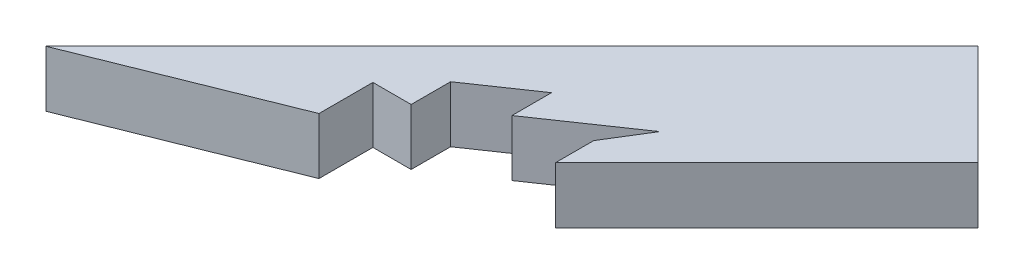
ISO-10303-21;
HEADER;
FILE_DESCRIPTION(('STEP AP214'),'2;1');
FILE_NAME('part.step','',(''),(''),'','','');
FILE_SCHEMA(('AUTOMOTIVE_DESIGN { 1 0 10303 214 1 1 1 1 }'));
ENDSEC;
DATA;
#1=APPLICATION_CONTEXT('core data for automotive mechanical design processes');
#2=APPLICATION_PROTOCOL_DEFINITION('international standard','automotive_design',2000,#1);
#3=PRODUCT_CONTEXT('',#1,'mechanical');
#4=PRODUCT('Part','Part','',(#3));
#5=PRODUCT_RELATED_PRODUCT_CATEGORY('part','',(#4));
#6=PRODUCT_DEFINITION_FORMATION('','',#4);
#7=PRODUCT_DEFINITION_CONTEXT('part definition',#1,'design');
#8=PRODUCT_DEFINITION('design','',#6,#7);
#9=PRODUCT_DEFINITION_SHAPE('','',#8);
#10=(LENGTH_UNIT() NAMED_UNIT(*) SI_UNIT(.MILLI.,.METRE.));
#11=(NAMED_UNIT(*) PLANE_ANGLE_UNIT() SI_UNIT($,.RADIAN.));
#12=(NAMED_UNIT(*) SI_UNIT($,.STERADIAN.) SOLID_ANGLE_UNIT());
#13=UNCERTAINTY_MEASURE_WITH_UNIT(LENGTH_MEASURE(1.E-05),#10,'distance_accuracy_value','');
#14=(GEOMETRIC_REPRESENTATION_CONTEXT(3) GLOBAL_UNCERTAINTY_ASSIGNED_CONTEXT((#13)) GLOBAL_UNIT_ASSIGNED_CONTEXT((#10,
#11,#12)) REPRESENTATION_CONTEXT('',''));
#15=CARTESIAN_POINT('',(0.,0.,0.));
#16=DIRECTION('',(0.,0.,1.));
#17=DIRECTION('',(1.,0.,0.));
#18=AXIS2_PLACEMENT_3D('',#15,#16,#17);
#19=CARTESIAN_POINT('',(-68.6002195806966,12.7,25.6760821859179));
#20=DIRECTION('',(-0.372818660827134,0.,-0.927904222503089));
#21=DIRECTION('',(-0.927904222503089,0.,0.372818660827134));
#22=AXIS2_PLACEMENT_3D('',#19,#20,#21);
#23=PLANE('',#22);
#24=DIRECTION('',(0.927904222503089,0.,-0.372818660827134));
#25=VECTOR('',#24,1.);
#26=CARTESIAN_POINT('',(-68.6002195806966,0.,25.6760821859179));
#27=LINE('',#26,#25);
#28=CARTESIAN_POINT('',(-112.504360112342,0.,43.3161386495255));
#29=VERTEX_POINT('',#28);
#30=CARTESIAN_POINT('',(-68.6002195806966,0.,25.6760821859179));
#31=VERTEX_POINT('',#30);
#32=EDGE_CURVE('E153',#29,#31,#27,.T.);
#33=ORIENTED_EDGE('',*,*,#32,.T.);
#34=DIRECTION('',(0.,-1.,0.));
#35=VECTOR('',#34,1.);
#36=CARTESIAN_POINT('',(-68.6002195806966,12.7,25.6760821859179));
#37=LINE('',#36,#35);
#38=CARTESIAN_POINT('',(-68.6002195806966,12.7,25.6760821859179));
#39=VERTEX_POINT('',#38);
#40=EDGE_CURVE('E11',#39,#31,#37,.T.);
#41=ORIENTED_EDGE('',*,*,#40,.F.);
#42=DIRECTION('',(0.927904222503089,0.,-0.372818660827134));
#43=VECTOR('',#42,1.);
#44=CARTESIAN_POINT('',(-68.6002195806966,12.7,25.6760821859179));
#45=LINE('',#44,#43);
#46=CARTESIAN_POINT('',(-112.504360112342,12.7,43.3161386495255));
#47=VERTEX_POINT('',#46);
#48=EDGE_CURVE('E175',#47,#39,#45,.T.);
#49=ORIENTED_EDGE('',*,*,#48,.F.);
#50=DIRECTION('',(0.,-1.,0.));
#51=VECTOR('',#50,1.);
#52=CARTESIAN_POINT('',(-112.504360112342,12.7,43.3161386495255));
#53=LINE('',#52,#51);
#54=EDGE_CURVE('E149',#47,#29,#53,.T.);
#55=ORIENTED_EDGE('',*,*,#54,.T.);
#56=EDGE_LOOP('',(#33,#41,#49,#55));
#57=FACE_BOUND('',#56,.T.);
#58=ADVANCED_FACE('F33',(#57),#23,.F.);
#59=CARTESIAN_POINT('',(-68.6002195806966,12.7,13.524043288766));
#60=DIRECTION('',(-1.,0.,0.));
#61=DIRECTION('',(0.,0.,1.));
#62=AXIS2_PLACEMENT_3D('',#59,#60,#61);
#63=PLANE('',#62);
#64=DIRECTION('',(0.,0.,-1.));
#65=VECTOR('',#64,1.);
#66=CARTESIAN_POINT('',(-68.6002195806966,0.,13.524043288766));
#67=LINE('',#66,#65);
#68=CARTESIAN_POINT('',(-68.6002195806966,0.,13.524043288766));
#69=VERTEX_POINT('',#68);
#70=EDGE_CURVE('E156',#31,#69,#67,.T.);
#71=ORIENTED_EDGE('',*,*,#70,.T.);
#72=DIRECTION('',(0.,-1.,0.));
#73=VECTOR('',#72,1.);
#74=CARTESIAN_POINT('',(-68.6002195806966,12.7,13.524043288766));
#75=LINE('',#74,#73);
#76=CARTESIAN_POINT('',(-68.6002195806966,12.7,13.524043288766));
#77=VERTEX_POINT('',#76);
#78=EDGE_CURVE('E41',#77,#69,#75,.T.);
#79=ORIENTED_EDGE('',*,*,#78,.F.);
#80=DIRECTION('',(0.,0.,-1.));
#81=VECTOR('',#80,1.);
#82=CARTESIAN_POINT('',(-68.6002195806966,12.7,13.524043288766));
#83=LINE('',#82,#81);
#84=EDGE_CURVE('E104',#39,#77,#83,.T.);
#85=ORIENTED_EDGE('',*,*,#84,.F.);
#86=ORIENTED_EDGE('',*,*,#40,.T.);
#87=EDGE_LOOP('',(#71,#79,#85,#86));
#88=FACE_BOUND('',#87,.T.);
#89=ADVANCED_FACE('F253',(#88),#63,.F.);
#90=CARTESIAN_POINT('',(-59.9761919762662,12.7,13.524043288766));
#91=DIRECTION('',(0.,0.,-1.));
#92=DIRECTION('',(-1.,0.,0.));
#93=AXIS2_PLACEMENT_3D('',#90,#91,#92);
#94=PLANE('',#93);
#95=DIRECTION('',(1.,0.,0.));
#96=VECTOR('',#95,1.);
#97=CARTESIAN_POINT('',(-59.9761919762662,0.,13.524043288766));
#98=LINE('',#97,#96);
#99=CARTESIAN_POINT('',(-59.9761919762662,0.,13.524043288766));
#100=VERTEX_POINT('',#99);
#101=EDGE_CURVE('E158',#69,#100,#98,.T.);
#102=ORIENTED_EDGE('',*,*,#101,.T.);
#103=DIRECTION('',(0.,-1.,0.));
#104=VECTOR('',#103,1.);
#105=CARTESIAN_POINT('',(-59.9761919762662,12.7,13.524043288766));
#106=LINE('',#105,#104);
#107=CARTESIAN_POINT('',(-59.9761919762662,12.7,13.524043288766));
#108=VERTEX_POINT('',#107);
#109=EDGE_CURVE('E194',#108,#100,#106,.T.);
#110=ORIENTED_EDGE('',*,*,#109,.F.);
#111=DIRECTION('',(1.,0.,0.));
#112=VECTOR('',#111,1.);
#113=CARTESIAN_POINT('',(-59.9761919762662,12.7,13.524043288766));
#114=LINE('',#113,#112);
#115=EDGE_CURVE('E202',#77,#108,#114,.T.);
#116=ORIENTED_EDGE('',*,*,#115,.F.);
#117=ORIENTED_EDGE('',*,*,#78,.T.);
#118=EDGE_LOOP('',(#102,#110,#116,#117));
#119=FACE_BOUND('',#118,.T.);
#120=ADVANCED_FACE('F200',(#119),#94,.F.);
#121=CARTESIAN_POINT('',(-59.9761919762662,12.7,4.63318314706994));
#122=DIRECTION('',(-1.,0.,0.));
#123=DIRECTION('',(0.,0.,1.));
#124=AXIS2_PLACEMENT_3D('',#121,#122,#123);
#125=PLANE('',#124);
#126=DIRECTION('',(0.,0.,-1.));
#127=VECTOR('',#126,1.);
#128=CARTESIAN_POINT('',(-59.9761919762662,0.,4.63318314706994));
#129=LINE('',#128,#127);
#130=CARTESIAN_POINT('',(-59.9761919762662,0.,4.63318314706994));
#131=VERTEX_POINT('',#130);
#132=EDGE_CURVE('E160',#100,#131,#129,.T.);
#133=ORIENTED_EDGE('',*,*,#132,.T.);
#134=DIRECTION('',(0.,-1.,0.));
#135=VECTOR('',#134,1.);
#136=CARTESIAN_POINT('',(-59.9761919762662,12.7,4.63318314706994));
#137=LINE('',#136,#135);
#138=CARTESIAN_POINT('',(-59.9761919762662,12.7,4.63318314706994));
#139=VERTEX_POINT('',#138);
#140=EDGE_CURVE('E191',#139,#131,#137,.T.);
#141=ORIENTED_EDGE('',*,*,#140,.F.);
#142=DIRECTION('',(0.,0.,-1.));
#143=VECTOR('',#142,1.);
#144=CARTESIAN_POINT('',(-59.9761919762662,12.7,4.63318314706994));
#145=LINE('',#144,#143);
#146=EDGE_CURVE('E220',#108,#139,#145,.T.);
#147=ORIENTED_EDGE('',*,*,#146,.F.);
#148=ORIENTED_EDGE('',*,*,#109,.T.);
#149=EDGE_LOOP('',(#133,#141,#147,#148));
#150=FACE_BOUND('',#149,.T.);
#151=ADVANCED_FACE('F211',(#150),#125,.F.);
#152=CARTESIAN_POINT('',(-46.4521486875001,12.7,-4.6060147432754));
#153=DIRECTION('',(-0.564097617594852,0.,-0.825708106914188));
#154=DIRECTION('',(-0.825708106914188,0.,0.564097617594852));
#155=AXIS2_PLACEMENT_3D('',#152,#153,#154);
#156=PLANE('',#155);
#157=DIRECTION('',(0.825708106914188,0.,-0.564097617594852));
#158=VECTOR('',#157,1.);
#159=CARTESIAN_POINT('',(-46.4521486875001,0.,-4.6060147432754));
#160=LINE('',#159,#158);
#161=CARTESIAN_POINT('',(-46.4521486875001,0.,-4.6060147432754));
#162=VERTEX_POINT('',#161);
#163=EDGE_CURVE('E162',#131,#162,#160,.T.);
#164=ORIENTED_EDGE('',*,*,#163,.T.);
#165=DIRECTION('',(0.,-1.,0.));
#166=VECTOR('',#165,1.);
#167=CARTESIAN_POINT('',(-46.4521486875001,12.7,-4.6060147432754));
#168=LINE('',#167,#166);
#169=CARTESIAN_POINT('',(-46.4521486875001,12.7,-4.6060147432754));
#170=VERTEX_POINT('',#169);
#171=EDGE_CURVE('E188',#170,#162,#168,.T.);
#172=ORIENTED_EDGE('',*,*,#171,.F.);
#173=DIRECTION('',(0.825708106914188,0.,-0.564097617594852));
#174=VECTOR('',#173,1.);
#175=CARTESIAN_POINT('',(-46.4521486875001,12.7,-4.6060147432754));
#176=LINE('',#175,#174);
#177=EDGE_CURVE('E217',#139,#170,#176,.T.);
#178=ORIENTED_EDGE('',*,*,#177,.F.);
#179=ORIENTED_EDGE('',*,*,#140,.T.);
#180=EDGE_LOOP('',(#164,#172,#178,#179));
#181=FACE_BOUND('',#180,.T.);
#182=ADVANCED_FACE('F215',(#181),#156,.F.);
#183=CARTESIAN_POINT('',(-46.4521486875001,12.7,4.31201380221525));
#184=DIRECTION('',(1.,0.,0.));
#185=DIRECTION('',(0.,0.,-1.));
#186=AXIS2_PLACEMENT_3D('',#183,#184,#185);
#187=PLANE('',#186);
#188=DIRECTION('',(0.,0.,1.));
#189=VECTOR('',#188,1.);
#190=CARTESIAN_POINT('',(-46.4521486875001,0.,4.31201380221525));
#191=LINE('',#190,#189);
#192=CARTESIAN_POINT('',(-46.4521486875001,0.,4.31201380221525));
#193=VERTEX_POINT('',#192);
#194=EDGE_CURVE('E164',#162,#193,#191,.T.);
#195=ORIENTED_EDGE('',*,*,#194,.T.);
#196=DIRECTION('',(0.,-1.,0.));
#197=VECTOR('',#196,1.);
#198=CARTESIAN_POINT('',(-46.4521486875001,12.7,4.31201380221525));
#199=LINE('',#198,#197);
#200=CARTESIAN_POINT('',(-46.4521486875001,12.7,4.31201380221525));
#201=VERTEX_POINT('',#200);
#202=EDGE_CURVE('E185',#201,#193,#199,.T.);
#203=ORIENTED_EDGE('',*,*,#202,.F.);
#204=DIRECTION('',(0.,0.,1.));
#205=VECTOR('',#204,1.);
#206=CARTESIAN_POINT('',(-46.4521486875001,12.7,4.31201380221525));
#207=LINE('',#206,#205);
#208=EDGE_CURVE('E219',#170,#201,#207,.T.);
#209=ORIENTED_EDGE('',*,*,#208,.F.);
#210=ORIENTED_EDGE('',*,*,#171,.T.);
#211=EDGE_LOOP('',(#195,#203,#209,#210));
#212=FACE_BOUND('',#211,.T.);
#213=ADVANCED_FACE('F266',(#212),#187,.F.);
#214=CARTESIAN_POINT('',(-26.656085322785,12.7,-9.2120294865508));
#215=DIRECTION('',(-0.564097617594852,0.,-0.825708106914188));
#216=DIRECTION('',(-0.825708106914188,0.,0.564097617594852));
#217=AXIS2_PLACEMENT_3D('',#214,#215,#216);
#218=PLANE('',#217);
#219=DIRECTION('',(0.825708106914188,0.,-0.564097617594852));
#220=VECTOR('',#219,1.);
#221=CARTESIAN_POINT('',(-26.656085322785,0.,-9.2120294865508));
#222=LINE('',#221,#220);
#223=CARTESIAN_POINT('',(-26.656085322785,0.,-9.2120294865508));
#224=VERTEX_POINT('',#223);
#225=EDGE_CURVE('E166',#193,#224,#222,.T.);
#226=ORIENTED_EDGE('',*,*,#225,.T.);
#227=DIRECTION('',(0.,-1.,0.));
#228=VECTOR('',#227,1.);
#229=CARTESIAN_POINT('',(-26.656085322785,12.7,-9.2120294865508));
#230=LINE('',#229,#228);
#231=CARTESIAN_POINT('',(-26.656085322785,12.7,-9.2120294865508));
#232=VERTEX_POINT('',#231);
#233=EDGE_CURVE('E182',#232,#224,#230,.T.);
#234=ORIENTED_EDGE('',*,*,#233,.F.);
#235=DIRECTION('',(0.825708106914188,0.,-0.564097617594852));
#236=VECTOR('',#235,1.);
#237=CARTESIAN_POINT('',(-26.656085322785,12.7,-9.2120294865508));
#238=LINE('',#237,#236);
#239=EDGE_CURVE('E222',#201,#232,#238,.T.);
#240=ORIENTED_EDGE('',*,*,#239,.F.);
#241=ORIENTED_EDGE('',*,*,#202,.T.);
#242=EDGE_LOOP('',(#226,#234,#240,#241));
#243=FACE_BOUND('',#242,.T.);
#244=ADVANCED_FACE('F269',(#243),#218,.F.);
#245=CARTESIAN_POINT('',(-32.340103516614,12.7,0.));
#246=DIRECTION('',(0.851036012799682,0.,0.525107327046595));
#247=DIRECTION('',(0.525107327046595,0.,-0.851036012799682));
#248=AXIS2_PLACEMENT_3D('',#245,#246,#247);
#249=PLANE('',#248);
#250=DIRECTION('',(-0.525107327046595,0.,0.851036012799682));
#251=VECTOR('',#250,1.);
#252=CARTESIAN_POINT('',(-32.340103516614,0.,0.));
#253=LINE('',#252,#251);
#254=CARTESIAN_POINT('',(-32.340103516614,0.,0.));
#255=VERTEX_POINT('',#254);
#256=EDGE_CURVE('E168',#224,#255,#253,.T.);
#257=ORIENTED_EDGE('',*,*,#256,.T.);
#258=DIRECTION('',(0.,-1.,0.));
#259=VECTOR('',#258,1.);
#260=CARTESIAN_POINT('',(-32.340103516614,12.7,0.));
#261=LINE('',#260,#259);
#262=CARTESIAN_POINT('',(-32.340103516614,12.7,0.));
#263=VERTEX_POINT('',#262);
#264=EDGE_CURVE('E179',#263,#255,#261,.T.);
#265=ORIENTED_EDGE('',*,*,#264,.F.);
#266=DIRECTION('',(-0.525107327046595,0.,0.851036012799682));
#267=VECTOR('',#266,1.);
#268=CARTESIAN_POINT('',(-32.340103516614,12.7,0.));
#269=LINE('',#268,#267);
#270=EDGE_CURVE('E228',#232,#263,#269,.T.);
#271=ORIENTED_EDGE('',*,*,#270,.F.);
#272=ORIENTED_EDGE('',*,*,#233,.T.);
#273=EDGE_LOOP('',(#257,#265,#271,#272));
#274=FACE_BOUND('',#273,.T.);
#275=ADVANCED_FACE('F234',(#274),#249,.F.);
#276=CARTESIAN_POINT('',(-32.340103516614,12.7,8.62402760443051));
#277=DIRECTION('',(1.,0.,0.));
#278=DIRECTION('',(0.,0.,-1.));
#279=AXIS2_PLACEMENT_3D('',#276,#277,#278);
#280=PLANE('',#279);
#281=DIRECTION('',(0.,0.,1.));
#282=VECTOR('',#281,1.);
#283=CARTESIAN_POINT('',(-32.340103516614,0.,8.62402760443051));
#284=LINE('',#283,#282);
#285=CARTESIAN_POINT('',(-32.340103516614,0.,8.62402760443051));
#286=VERTEX_POINT('',#285);
#287=EDGE_CURVE('E170',#255,#286,#284,.T.);
#288=ORIENTED_EDGE('',*,*,#287,.T.);
#289=DIRECTION('',(0.,-1.,0.));
#290=VECTOR('',#289,1.);
#291=CARTESIAN_POINT('',(-32.340103516614,12.7,8.62402760443051));
#292=LINE('',#291,#290);
#293=CARTESIAN_POINT('',(-32.340103516614,12.7,8.62402760443051));
#294=VERTEX_POINT('',#293);
#295=EDGE_CURVE('E144',#294,#286,#292,.T.);
#296=ORIENTED_EDGE('',*,*,#295,.F.);
#297=DIRECTION('',(0.,0.,1.));
#298=VECTOR('',#297,1.);
#299=CARTESIAN_POINT('',(-32.340103516614,12.7,8.62402760443051));
#300=LINE('',#299,#298);
#301=EDGE_CURVE('E135',#263,#294,#300,.T.);
#302=ORIENTED_EDGE('',*,*,#301,.F.);
#303=ORIENTED_EDGE('',*,*,#264,.T.);
#304=EDGE_LOOP('',(#288,#296,#302,#303));
#305=FACE_BOUND('',#304,.T.);
#306=ADVANCED_FACE('F238',(#305),#280,.F.);
#307=CARTESIAN_POINT('',(15.2880489351267,12.7,-39.0041248473104));
#308=DIRECTION('',(-0.707106781186549,0.,-0.707106781186546));
#309=DIRECTION('',(-0.707106781186546,0.,0.707106781186549));
#310=AXIS2_PLACEMENT_3D('',#307,#308,#309);
#311=PLANE('',#310);
#312=DIRECTION('',(0.707106781186546,0.,-0.707106781186549));
#313=VECTOR('',#312,1.);
#314=CARTESIAN_POINT('',(15.2880489351267,0.,-39.0041248473104));
#315=LINE('',#314,#313);
#316=CARTESIAN_POINT('',(15.2880489351267,0.,-39.0041248473104));
#317=VERTEX_POINT('',#316);
#318=EDGE_CURVE('E143',#286,#317,#315,.T.);
#319=ORIENTED_EDGE('',*,*,#318,.T.);
#320=DIRECTION('',(0.,-1.,0.));
#321=VECTOR('',#320,1.);
#322=CARTESIAN_POINT('',(15.2880489351267,12.7,-39.0041248473104));
#323=LINE('',#322,#321);
#324=CARTESIAN_POINT('',(15.2880489351267,12.7,-39.0041248473104));
#325=VERTEX_POINT('',#324);
#326=EDGE_CURVE('E140',#325,#317,#323,.T.);
#327=ORIENTED_EDGE('',*,*,#326,.F.);
#328=DIRECTION('',(0.707106781186546,0.,-0.707106781186549));
#329=VECTOR('',#328,1.);
#330=CARTESIAN_POINT('',(15.2880489351267,12.7,-39.0041248473104));
#331=LINE('',#330,#329);
#332=EDGE_CURVE('E129',#294,#325,#331,.T.);
#333=ORIENTED_EDGE('',*,*,#332,.F.);
#334=ORIENTED_EDGE('',*,*,#295,.T.);
#335=EDGE_LOOP('',(#319,#327,#333,#334));
#336=FACE_BOUND('',#335,.T.);
#337=ADVANCED_FACE('F141',(#336),#311,.F.);
#338=CARTESIAN_POINT('',(-7.44802384019008,12.7,-61.7401976226271));
#339=DIRECTION('',(-0.707106781186546,0.,0.707106781186549));
#340=DIRECTION('',(0.707106781186549,0.,0.707106781186546));
#341=AXIS2_PLACEMENT_3D('',#338,#339,#340);
#342=PLANE('',#341);
#343=DIRECTION('',(-0.707106781186549,0.,-0.707106781186546));
#344=VECTOR('',#343,1.);
#345=CARTESIAN_POINT('',(-7.44802384019008,0.,-61.7401976226271));
#346=LINE('',#345,#344);
#347=CARTESIAN_POINT('',(-7.44802384019008,0.,-61.7401976226271));
#348=VERTEX_POINT('',#347);
#349=EDGE_CURVE('E90',#317,#348,#346,.T.);
#350=ORIENTED_EDGE('',*,*,#349,.T.);
#351=DIRECTION('',(0.,-1.,0.));
#352=VECTOR('',#351,1.);
#353=CARTESIAN_POINT('',(-7.44802384019008,12.7,-61.7401976226271));
#354=LINE('',#353,#352);
#355=CARTESIAN_POINT('',(-7.44802384019008,12.7,-61.7401976226271));
#356=VERTEX_POINT('',#355);
#357=EDGE_CURVE('E145',#356,#348,#354,.T.);
#358=ORIENTED_EDGE('',*,*,#357,.F.);
#359=DIRECTION('',(-0.707106781186549,0.,-0.707106781186546));
#360=VECTOR('',#359,1.);
#361=CARTESIAN_POINT('',(-7.44802384019008,12.7,-61.7401976226271));
#362=LINE('',#361,#360);
#363=EDGE_CURVE('E133',#325,#356,#362,.T.);
#364=ORIENTED_EDGE('',*,*,#363,.F.);
#365=ORIENTED_EDGE('',*,*,#326,.T.);
#366=EDGE_LOOP('',(#350,#358,#364,#365));
#367=FACE_BOUND('',#366,.T.);
#368=ADVANCED_FACE('F147',(#367),#342,.F.);
#369=CARTESIAN_POINT('',(-112.504360112342,12.7,43.3161386495255));
#370=DIRECTION('',(0.707106781186549,0.,0.707106781186546));
#371=DIRECTION('',(0.707106781186546,0.,-0.707106781186549));
#372=AXIS2_PLACEMENT_3D('',#369,#370,#371);
#373=PLANE('',#372);
#374=DIRECTION('',(-0.707106781186546,0.,0.707106781186549));
#375=VECTOR('',#374,1.);
#376=CARTESIAN_POINT('',(-112.504360112342,0.,43.3161386495255));
#377=LINE('',#376,#375);
#378=EDGE_CURVE('E96',#348,#29,#377,.T.);
#379=ORIENTED_EDGE('',*,*,#378,.T.);
#380=ORIENTED_EDGE('',*,*,#54,.F.);
#381=DIRECTION('',(-0.707106781186546,0.,0.707106781186549));
#382=VECTOR('',#381,1.);
#383=CARTESIAN_POINT('',(-112.504360112342,12.7,43.3161386495255));
#384=LINE('',#383,#382);
#385=EDGE_CURVE('E49',#356,#47,#384,.T.);
#386=ORIENTED_EDGE('',*,*,#385,.F.);
#387=ORIENTED_EDGE('',*,*,#357,.T.);
#388=EDGE_LOOP('',(#379,#380,#386,#387));
#389=FACE_BOUND('',#388,.T.);
#390=ADVANCED_FACE('F242',(#389),#373,.F.);
#391=CARTESIAN_POINT('',(0.,12.7,0.));
#392=DIRECTION('',(0.,-1.,0.));
#393=DIRECTION('',(0.,0.,-1.));
#394=AXIS2_PLACEMENT_3D('',#391,#392,#393);
#395=PLANE('',#394);
#396=ORIENTED_EDGE('',*,*,#48,.T.);
#397=ORIENTED_EDGE('',*,*,#84,.T.);
#398=ORIENTED_EDGE('',*,*,#115,.T.);
#399=ORIENTED_EDGE('',*,*,#146,.T.);
#400=ORIENTED_EDGE('',*,*,#177,.T.);
#401=ORIENTED_EDGE('',*,*,#208,.T.);
#402=ORIENTED_EDGE('',*,*,#239,.T.);
#403=ORIENTED_EDGE('',*,*,#270,.T.);
#404=ORIENTED_EDGE('',*,*,#301,.T.);
#405=ORIENTED_EDGE('',*,*,#332,.T.);
#406=ORIENTED_EDGE('',*,*,#363,.T.);
#407=ORIENTED_EDGE('',*,*,#385,.T.);
#408=EDGE_LOOP('',(#396,#397,#398,#399,#400,#401,#402,#403,#404,#405,#406,#407));
#409=FACE_BOUND('',#408,.T.);
#410=ADVANCED_FACE('F131',(#409),#395,.F.);
#411=CARTESIAN_POINT('',(0.,0.,0.));
#412=DIRECTION('',(0.,-1.,0.));
#413=DIRECTION('',(0.,0.,-1.));
#414=AXIS2_PLACEMENT_3D('',#411,#412,#413);
#415=PLANE('',#414);
#416=ORIENTED_EDGE('',*,*,#32,.F.);
#417=ORIENTED_EDGE('',*,*,#378,.F.);
#418=ORIENTED_EDGE('',*,*,#349,.F.);
#419=ORIENTED_EDGE('',*,*,#318,.F.);
#420=ORIENTED_EDGE('',*,*,#287,.F.);
#421=ORIENTED_EDGE('',*,*,#256,.F.);
#422=ORIENTED_EDGE('',*,*,#225,.F.);
#423=ORIENTED_EDGE('',*,*,#194,.F.);
#424=ORIENTED_EDGE('',*,*,#163,.F.);
#425=ORIENTED_EDGE('',*,*,#132,.F.);
#426=ORIENTED_EDGE('',*,*,#101,.F.);
#427=ORIENTED_EDGE('',*,*,#70,.F.);
#428=EDGE_LOOP('',(#416,#417,#418,#419,#420,#421,#422,#423,#424,#425,#426,#427));
#429=FACE_BOUND('',#428,.T.);
#430=ADVANCED_FACE('F206',(#429),#415,.T.);
#431=CLOSED_SHELL('',(#58,#89,#120,#151,#182,#213,#244,#275,#306,#337,#368,#390,#410,#430));
#432=MANIFOLD_SOLID_BREP('B2',#431);
#433=ADVANCED_BREP_SHAPE_REPRESENTATION('',(#18,#432),#14);
#434=SHAPE_DEFINITION_REPRESENTATION(#9,#433);
ENDSEC;
END-ISO-10303-21;
